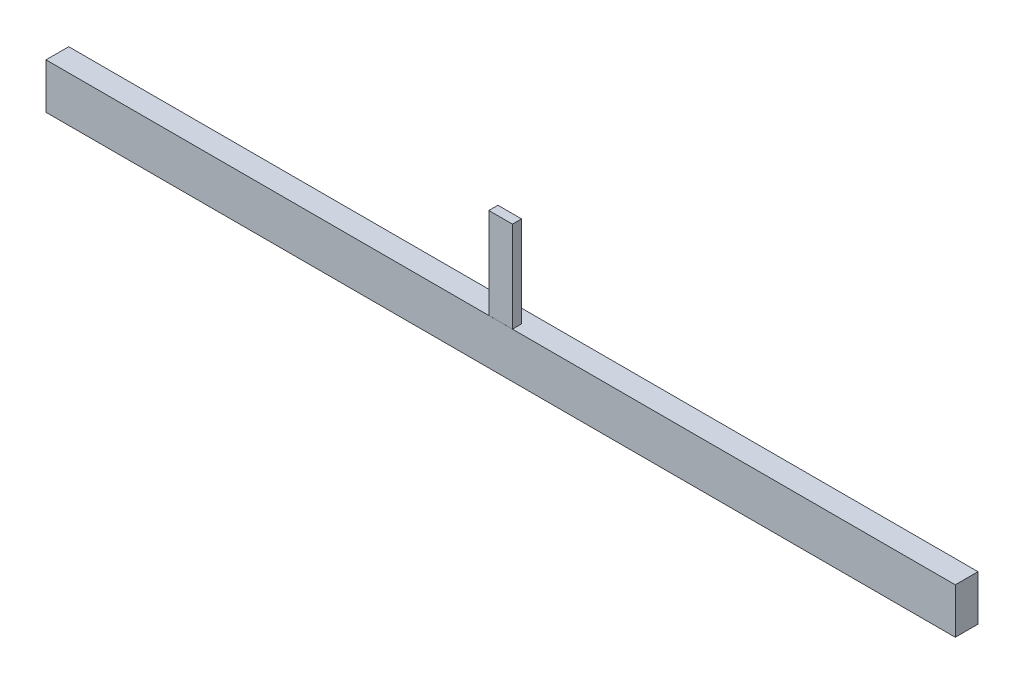
ISO-10303-21;
HEADER;
FILE_DESCRIPTION(('STEP AP214'),'2;1');
FILE_NAME('part.step','',(''),(''),'','','');
FILE_SCHEMA(('AUTOMOTIVE_DESIGN { 1 0 10303 214 1 1 1 1 }'));
ENDSEC;
DATA;
#1=APPLICATION_CONTEXT('core data for automotive mechanical design processes');
#2=APPLICATION_PROTOCOL_DEFINITION('international standard','automotive_design',2000,#1);
#3=PRODUCT_CONTEXT('',#1,'mechanical');
#4=PRODUCT('Part','Part','',(#3));
#5=PRODUCT_RELATED_PRODUCT_CATEGORY('part','',(#4));
#6=PRODUCT_DEFINITION_FORMATION('','',#4);
#7=PRODUCT_DEFINITION_CONTEXT('part definition',#1,'design');
#8=PRODUCT_DEFINITION('design','',#6,#7);
#9=PRODUCT_DEFINITION_SHAPE('','',#8);
#10=(LENGTH_UNIT() NAMED_UNIT(*) SI_UNIT(.MILLI.,.METRE.));
#11=(NAMED_UNIT(*) PLANE_ANGLE_UNIT() SI_UNIT($,.RADIAN.));
#12=(NAMED_UNIT(*) SI_UNIT($,.STERADIAN.) SOLID_ANGLE_UNIT());
#13=UNCERTAINTY_MEASURE_WITH_UNIT(LENGTH_MEASURE(1.E-05),#10,'distance_accuracy_value','');
#14=(GEOMETRIC_REPRESENTATION_CONTEXT(3) GLOBAL_UNCERTAINTY_ASSIGNED_CONTEXT((#13)) GLOBAL_UNIT_ASSIGNED_CONTEXT((#10,
#11,#12)) REPRESENTATION_CONTEXT('',''));
#15=CARTESIAN_POINT('',(0.,0.,0.));
#16=DIRECTION('',(0.,0.,1.));
#17=DIRECTION('',(1.,0.,0.));
#18=AXIS2_PLACEMENT_3D('',#15,#16,#17);
#19=CARTESIAN_POINT('',(-10.,51.3092042584276,1.88306996396935));
#20=DIRECTION('',(-1.,0.,0.));
#21=DIRECTION('',(0.,0.,1.));
#22=AXIS2_PLACEMENT_3D('',#19,#20,#21);
#23=PLANE('',#22);
#24=DIRECTION('',(0.,0.,1.));
#25=VECTOR('',#24,1.);
#26=CARTESIAN_POINT('',(-10.,-2.00034068669365,0.2));
#27=LINE('',#26,#25);
#28=CARTESIAN_POINT('',(-10.,-2.00034068669365,-0.3));
#29=VERTEX_POINT('',#28);
#30=CARTESIAN_POINT('',(-10.,-2.00034068669365,0.2));
#31=VERTEX_POINT('',#30);
#32=EDGE_CURVE('E115',#29,#31,#27,.T.);
#33=ORIENTED_EDGE('',*,*,#32,.T.);
#34=DIRECTION('',(0.,1.,0.));
#35=VECTOR('',#34,1.);
#36=CARTESIAN_POINT('',(-10.,0.,0.2));
#37=LINE('',#36,#35);
#38=CARTESIAN_POINT('',(-10.,-1.00034068669365,0.2));
#39=VERTEX_POINT('',#38);
#40=EDGE_CURVE('E97',#31,#39,#37,.T.);
#41=ORIENTED_EDGE('',*,*,#40,.T.);
#42=DIRECTION('',(0.,0.,-1.));
#43=VECTOR('',#42,1.);
#44=CARTESIAN_POINT('',(-10.,-1.00034068669365,0.2));
#45=LINE('',#44,#43);
#46=CARTESIAN_POINT('',(-10.,-1.00034068669365,-0.3));
#47=VERTEX_POINT('',#46);
#48=EDGE_CURVE('E101',#39,#47,#45,.T.);
#49=ORIENTED_EDGE('',*,*,#48,.T.);
#50=DIRECTION('',(0.,1.,0.));
#51=VECTOR('',#50,1.);
#52=CARTESIAN_POINT('',(-10.,0.,-0.3));
#53=LINE('',#52,#51);
#54=EDGE_CURVE('E53',#29,#47,#53,.T.);
#55=ORIENTED_EDGE('',*,*,#54,.F.);
#56=EDGE_LOOP('',(#33,#41,#49,#55));
#57=FACE_BOUND('',#56,.T.);
#58=ADVANCED_FACE('F45',(#57),#23,.T.);
#59=CARTESIAN_POINT('',(-17.9925225000234,-1.00034068669365,0.2));
#60=DIRECTION('',(0.,-1.,0.));
#61=DIRECTION('',(0.,0.,-1.));
#62=AXIS2_PLACEMENT_3D('',#59,#60,#61);
#63=PLANE('',#62);
#64=DIRECTION('',(-1.,0.,0.));
#65=VECTOR('',#64,1.);
#66=CARTESIAN_POINT('',(-17.9925225000234,-1.00034068669365,0.2));
#67=LINE('',#66,#65);
#68=CARTESIAN_POINT('',(10.,-1.00034068669365,0.2));
#69=VERTEX_POINT('',#68);
#70=EDGE_CURVE('E91',#69,#39,#67,.T.);
#71=ORIENTED_EDGE('',*,*,#70,.F.);
#72=DIRECTION('',(0.,0.,-1.));
#73=VECTOR('',#72,1.);
#74=CARTESIAN_POINT('',(10.,-1.00034068669365,0.2));
#75=LINE('',#74,#73);
#76=CARTESIAN_POINT('',(10.,-1.00034068669365,-0.3));
#77=VERTEX_POINT('',#76);
#78=EDGE_CURVE('E85',#69,#77,#75,.T.);
#79=ORIENTED_EDGE('',*,*,#78,.T.);
#80=DIRECTION('',(-1.,0.,0.));
#81=VECTOR('',#80,1.);
#82=CARTESIAN_POINT('',(-17.9925225000234,-1.00034068669365,-0.3));
#83=LINE('',#82,#81);
#84=EDGE_CURVE('E67',#77,#47,#83,.T.);
#85=ORIENTED_EDGE('',*,*,#84,.T.);
#86=ORIENTED_EDGE('',*,*,#48,.F.);
#87=EDGE_LOOP('',(#71,#79,#85,#86));
#88=FACE_BOUND('',#87,.T.);
#89=ADVANCED_FACE('F47',(#88),#63,.F.);
#90=CARTESIAN_POINT('',(-17.9925225000234,-2.00034068669365,0.2));
#91=DIRECTION('',(0.,1.,0.));
#92=DIRECTION('',(0.,0.,1.));
#93=AXIS2_PLACEMENT_3D('',#90,#91,#92);
#94=PLANE('',#93);
#95=DIRECTION('',(1.,0.,0.));
#96=VECTOR('',#95,1.);
#97=CARTESIAN_POINT('',(-17.9925225000234,-2.00034068669365,-0.3));
#98=LINE('',#97,#96);
#99=CARTESIAN_POINT('',(10.,-2.00034068669365,-0.3));
#100=VERTEX_POINT('',#99);
#101=EDGE_CURVE('E96',#29,#100,#98,.T.);
#102=ORIENTED_EDGE('',*,*,#101,.T.);
#103=DIRECTION('',(0.,0.,1.));
#104=VECTOR('',#103,1.);
#105=CARTESIAN_POINT('',(10.,-2.00034068669365,0.2));
#106=LINE('',#105,#104);
#107=CARTESIAN_POINT('',(10.,-2.00034068669365,0.2));
#108=VERTEX_POINT('',#107);
#109=EDGE_CURVE('E59',#100,#108,#106,.T.);
#110=ORIENTED_EDGE('',*,*,#109,.T.);
#111=DIRECTION('',(1.,0.,0.));
#112=VECTOR('',#111,1.);
#113=CARTESIAN_POINT('',(-17.9925225000234,-2.00034068669365,0.2));
#114=LINE('',#113,#112);
#115=EDGE_CURVE('E106',#31,#108,#114,.T.);
#116=ORIENTED_EDGE('',*,*,#115,.F.);
#117=ORIENTED_EDGE('',*,*,#32,.F.);
#118=EDGE_LOOP('',(#102,#110,#116,#117));
#119=FACE_BOUND('',#118,.T.);
#120=ADVANCED_FACE('F114',(#119),#94,.F.);
#121=CARTESIAN_POINT('',(0.,0.,0.2));
#122=DIRECTION('',(0.,0.,-1.));
#123=DIRECTION('',(-1.,0.,0.));
#124=AXIS2_PLACEMENT_3D('',#121,#122,#123);
#125=PLANE('',#124);
#126=ORIENTED_EDGE('',*,*,#115,.T.);
#127=DIRECTION('',(0.,1.,0.));
#128=VECTOR('',#127,1.);
#129=CARTESIAN_POINT('',(10.,0.,0.2));
#130=LINE('',#129,#128);
#131=EDGE_CURVE('E92',#108,#69,#130,.T.);
#132=ORIENTED_EDGE('',*,*,#131,.T.);
#133=ORIENTED_EDGE('',*,*,#70,.T.);
#134=ORIENTED_EDGE('',*,*,#40,.F.);
#135=EDGE_LOOP('',(#126,#132,#133,#134));
#136=FACE_BOUND('',#135,.T.);
#137=ADVANCED_FACE('F111',(#136),#125,.F.);
#138=CARTESIAN_POINT('',(0.,0.,-0.3));
#139=DIRECTION('',(0.,0.,-1.));
#140=DIRECTION('',(-1.,0.,0.));
#141=AXIS2_PLACEMENT_3D('',#138,#139,#140);
#142=PLANE('',#141);
#143=DIRECTION('',(0.,1.,0.));
#144=VECTOR('',#143,1.);
#145=CARTESIAN_POINT('',(10.,0.,-0.3));
#146=LINE('',#145,#144);
#147=EDGE_CURVE('E12',#100,#77,#146,.T.);
#148=ORIENTED_EDGE('',*,*,#147,.F.);
#149=ORIENTED_EDGE('',*,*,#101,.F.);
#150=ORIENTED_EDGE('',*,*,#54,.T.);
#151=ORIENTED_EDGE('',*,*,#84,.F.);
#152=EDGE_LOOP('',(#148,#149,#150,#151));
#153=FACE_BOUND('',#152,.T.);
#154=ADVANCED_FACE('F95',(#153),#142,.T.);
#155=CARTESIAN_POINT('',(10.,-37.,4.02783207081781));
#156=DIRECTION('',(-1.,0.,0.));
#157=DIRECTION('',(0.,0.,1.));
#158=AXIS2_PLACEMENT_3D('',#155,#156,#157);
#159=PLANE('',#158);
#160=ORIENTED_EDGE('',*,*,#109,.F.);
#161=ORIENTED_EDGE('',*,*,#147,.T.);
#162=ORIENTED_EDGE('',*,*,#78,.F.);
#163=ORIENTED_EDGE('',*,*,#131,.F.);
#164=EDGE_LOOP('',(#160,#161,#162,#163));
#165=FACE_BOUND('',#164,.T.);
#166=ADVANCED_FACE('F84',(#165),#159,.F.);
#167=CLOSED_SHELL('',(#58,#89,#120,#137,#154,#166));
#168=MANIFOLD_SOLID_BREP('B2',#167);
#169=CARTESIAN_POINT('',(0.26,-1.,0.2));
#170=DIRECTION('',(-1.,0.,0.));
#171=DIRECTION('',(0.,0.,1.));
#172=AXIS2_PLACEMENT_3D('',#169,#170,#171);
#173=PLANE('',#172);
#174=DIRECTION('',(0.,1.,0.));
#175=VECTOR('',#174,1.);
#176=CARTESIAN_POINT('',(0.26,-1.,0.));
#177=LINE('',#176,#175);
#178=CARTESIAN_POINT('',(0.26,-1.,0.));
#179=VERTEX_POINT('',#178);
#180=CARTESIAN_POINT('',(0.26,1.,0.));
#181=VERTEX_POINT('',#180);
#182=EDGE_CURVE('E245',#179,#181,#177,.T.);
#183=ORIENTED_EDGE('',*,*,#182,.T.);
#184=DIRECTION('',(0.,0.,-1.));
#185=VECTOR('',#184,1.);
#186=CARTESIAN_POINT('',(0.26,1.,0.2));
#187=LINE('',#186,#185);
#188=CARTESIAN_POINT('',(0.26,1.,0.2));
#189=VERTEX_POINT('',#188);
#190=EDGE_CURVE('E43',#189,#181,#187,.T.);
#191=ORIENTED_EDGE('',*,*,#190,.F.);
#192=DIRECTION('',(0.,1.,0.));
#193=VECTOR('',#192,1.);
#194=CARTESIAN_POINT('',(0.26,-1.,0.2));
#195=LINE('',#194,#193);
#196=CARTESIAN_POINT('',(0.26,-1.,0.2));
#197=VERTEX_POINT('',#196);
#198=EDGE_CURVE('E233',#197,#189,#195,.T.);
#199=ORIENTED_EDGE('',*,*,#198,.F.);
#200=DIRECTION('',(0.,0.,-1.));
#201=VECTOR('',#200,1.);
#202=CARTESIAN_POINT('',(0.26,-1.,0.2));
#203=LINE('',#202,#201);
#204=EDGE_CURVE('E241',#197,#179,#203,.T.);
#205=ORIENTED_EDGE('',*,*,#204,.T.);
#206=EDGE_LOOP('',(#183,#191,#199,#205));
#207=FACE_BOUND('',#206,.T.);
#208=ADVANCED_FACE('F182',(#207),#173,.F.);
#209=CARTESIAN_POINT('',(-0.26,1.,0.2));
#210=DIRECTION('',(0.,-1.,0.));
#211=DIRECTION('',(0.,0.,-1.));
#212=AXIS2_PLACEMENT_3D('',#209,#210,#211);
#213=PLANE('',#212);
#214=DIRECTION('',(-1.,0.,0.));
#215=VECTOR('',#214,1.);
#216=CARTESIAN_POINT('',(-0.26,1.,0.));
#217=LINE('',#216,#215);
#218=CARTESIAN_POINT('',(-0.26,1.,0.));
#219=VERTEX_POINT('',#218);
#220=EDGE_CURVE('E237',#181,#219,#217,.T.);
#221=ORIENTED_EDGE('',*,*,#220,.T.);
#222=DIRECTION('',(0.,0.,-1.));
#223=VECTOR('',#222,1.);
#224=CARTESIAN_POINT('',(-0.26,1.,0.2));
#225=LINE('',#224,#223);
#226=CARTESIAN_POINT('',(-0.26,1.,0.2));
#227=VERTEX_POINT('',#226);
#228=EDGE_CURVE('E190',#227,#219,#225,.T.);
#229=ORIENTED_EDGE('',*,*,#228,.F.);
#230=DIRECTION('',(-1.,0.,0.));
#231=VECTOR('',#230,1.);
#232=CARTESIAN_POINT('',(-0.26,1.,0.2));
#233=LINE('',#232,#231);
#234=EDGE_CURVE('E228',#189,#227,#233,.T.);
#235=ORIENTED_EDGE('',*,*,#234,.F.);
#236=ORIENTED_EDGE('',*,*,#190,.T.);
#237=EDGE_LOOP('',(#221,#229,#235,#236));
#238=FACE_BOUND('',#237,.T.);
#239=ADVANCED_FACE('F236',(#238),#213,.F.);
#240=CARTESIAN_POINT('',(-0.26,-1.,0.2));
#241=DIRECTION('',(1.,0.,0.));
#242=DIRECTION('',(0.,0.,-1.));
#243=AXIS2_PLACEMENT_3D('',#240,#241,#242);
#244=PLANE('',#243);
#245=DIRECTION('',(0.,-1.,0.));
#246=VECTOR('',#245,1.);
#247=CARTESIAN_POINT('',(-0.26,-1.,0.));
#248=LINE('',#247,#246);
#249=CARTESIAN_POINT('',(-0.26,-1.,0.));
#250=VERTEX_POINT('',#249);
#251=EDGE_CURVE('E215',#219,#250,#248,.T.);
#252=ORIENTED_EDGE('',*,*,#251,.T.);
#253=DIRECTION('',(0.,0.,-1.));
#254=VECTOR('',#253,1.);
#255=CARTESIAN_POINT('',(-0.26,-1.,0.2));
#256=LINE('',#255,#254);
#257=CARTESIAN_POINT('',(-0.26,-1.,0.2));
#258=VERTEX_POINT('',#257);
#259=EDGE_CURVE('E238',#258,#250,#256,.T.);
#260=ORIENTED_EDGE('',*,*,#259,.F.);
#261=DIRECTION('',(0.,-1.,0.));
#262=VECTOR('',#261,1.);
#263=CARTESIAN_POINT('',(-0.26,-1.,0.2));
#264=LINE('',#263,#262);
#265=EDGE_CURVE('E231',#227,#258,#264,.T.);
#266=ORIENTED_EDGE('',*,*,#265,.F.);
#267=ORIENTED_EDGE('',*,*,#228,.T.);
#268=EDGE_LOOP('',(#252,#260,#266,#267));
#269=FACE_BOUND('',#268,.T.);
#270=ADVANCED_FACE('F239',(#269),#244,.F.);
#271=CARTESIAN_POINT('',(-0.26,-1.,0.2));
#272=DIRECTION('',(0.,1.,0.));
#273=DIRECTION('',(0.,0.,1.));
#274=AXIS2_PLACEMENT_3D('',#271,#272,#273);
#275=PLANE('',#274);
#276=DIRECTION('',(1.,0.,0.));
#277=VECTOR('',#276,1.);
#278=CARTESIAN_POINT('',(-0.26,-1.,0.));
#279=LINE('',#278,#277);
#280=EDGE_CURVE('E221',#250,#179,#279,.T.);
#281=ORIENTED_EDGE('',*,*,#280,.T.);
#282=ORIENTED_EDGE('',*,*,#204,.F.);
#283=DIRECTION('',(1.,0.,0.));
#284=VECTOR('',#283,1.);
#285=CARTESIAN_POINT('',(-0.26,-1.,0.2));
#286=LINE('',#285,#284);
#287=EDGE_CURVE('E198',#258,#197,#286,.T.);
#288=ORIENTED_EDGE('',*,*,#287,.F.);
#289=ORIENTED_EDGE('',*,*,#259,.T.);
#290=EDGE_LOOP('',(#281,#282,#288,#289));
#291=FACE_BOUND('',#290,.T.);
#292=ADVANCED_FACE('F252',(#291),#275,.F.);
#293=CARTESIAN_POINT('',(0.,0.,0.2));
#294=DIRECTION('',(0.,0.,-1.));
#295=DIRECTION('',(-1.,0.,0.));
#296=AXIS2_PLACEMENT_3D('',#293,#294,#295);
#297=PLANE('',#296);
#298=ORIENTED_EDGE('',*,*,#198,.T.);
#299=ORIENTED_EDGE('',*,*,#234,.T.);
#300=ORIENTED_EDGE('',*,*,#265,.T.);
#301=ORIENTED_EDGE('',*,*,#287,.T.);
#302=EDGE_LOOP('',(#298,#299,#300,#301));
#303=FACE_BOUND('',#302,.T.);
#304=ADVANCED_FACE('F229',(#303),#297,.F.);
#305=CARTESIAN_POINT('',(0.,0.,0.));
#306=DIRECTION('',(0.,0.,-1.));
#307=DIRECTION('',(-1.,0.,0.));
#308=AXIS2_PLACEMENT_3D('',#305,#306,#307);
#309=PLANE('',#308);
#310=ORIENTED_EDGE('',*,*,#182,.F.);
#311=ORIENTED_EDGE('',*,*,#280,.F.);
#312=ORIENTED_EDGE('',*,*,#251,.F.);
#313=ORIENTED_EDGE('',*,*,#220,.F.);
#314=EDGE_LOOP('',(#310,#311,#312,#313));
#315=FACE_BOUND('',#314,.T.);
#316=ADVANCED_FACE('F255',(#315),#309,.T.);
#317=CLOSED_SHELL('',(#208,#239,#270,#292,#304,#316));
#318=MANIFOLD_SOLID_BREP('B6',#317);
#319=ADVANCED_BREP_SHAPE_REPRESENTATION('',(#18,#168,#318),#14);
#320=SHAPE_DEFINITION_REPRESENTATION(#9,#319);
ENDSEC;
END-ISO-10303-21;
